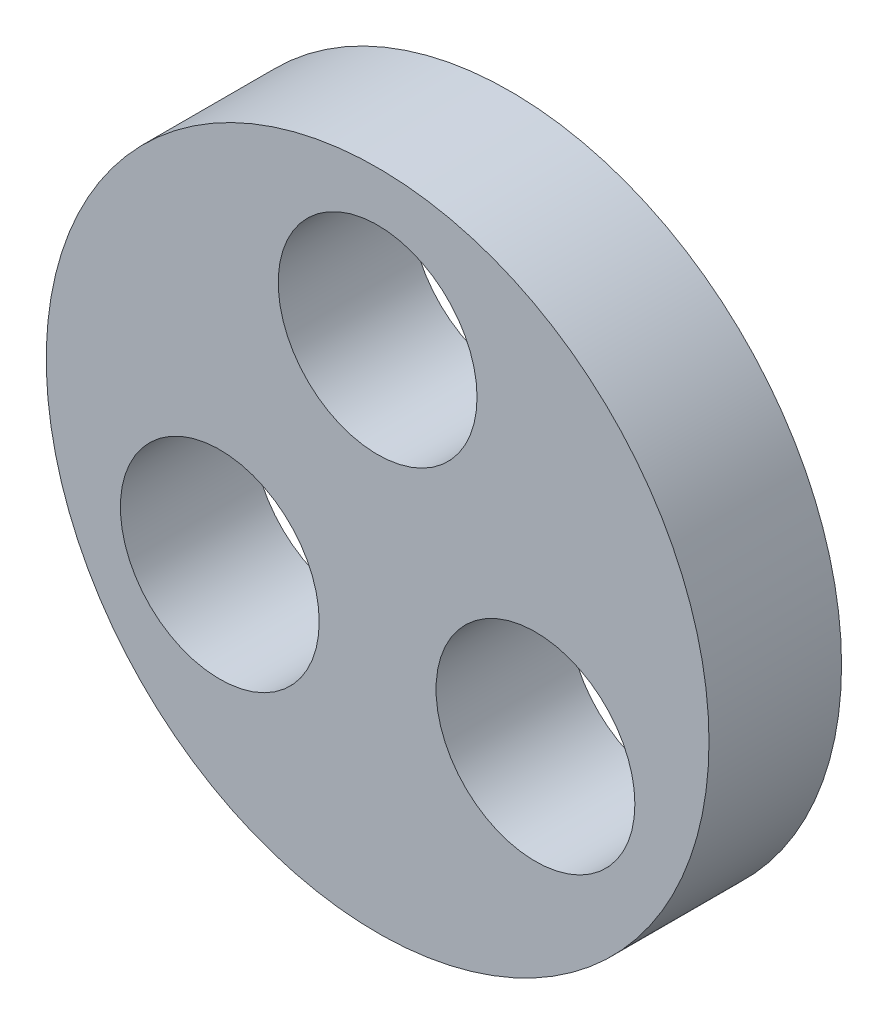
ISO-10303-21;
HEADER;
FILE_DESCRIPTION(('STEP AP214'),'2;1');
FILE_NAME('part.step','',(''),(''),'','','');
FILE_SCHEMA(('AUTOMOTIVE_DESIGN { 1 0 10303 214 1 1 1 1 }'));
ENDSEC;
DATA;
#1=APPLICATION_CONTEXT('core data for automotive mechanical design processes');
#2=APPLICATION_PROTOCOL_DEFINITION('international standard','automotive_design',2000,#1);
#3=PRODUCT_CONTEXT('',#1,'mechanical');
#4=PRODUCT('Part','Part','',(#3));
#5=PRODUCT_RELATED_PRODUCT_CATEGORY('part','',(#4));
#6=PRODUCT_DEFINITION_FORMATION('','',#4);
#7=PRODUCT_DEFINITION_CONTEXT('part definition',#1,'design');
#8=PRODUCT_DEFINITION('design','',#6,#7);
#9=PRODUCT_DEFINITION_SHAPE('','',#8);
#10=(LENGTH_UNIT() NAMED_UNIT(*) SI_UNIT(.MILLI.,.METRE.));
#11=(NAMED_UNIT(*) PLANE_ANGLE_UNIT() SI_UNIT($,.RADIAN.));
#12=(NAMED_UNIT(*) SI_UNIT($,.STERADIAN.) SOLID_ANGLE_UNIT());
#13=UNCERTAINTY_MEASURE_WITH_UNIT(LENGTH_MEASURE(1.E-05),#10,'distance_accuracy_value','');
#14=(GEOMETRIC_REPRESENTATION_CONTEXT(3) GLOBAL_UNCERTAINTY_ASSIGNED_CONTEXT((#13)) GLOBAL_UNIT_ASSIGNED_CONTEXT((#10,
#11,#12)) REPRESENTATION_CONTEXT('',''));
#15=CARTESIAN_POINT('',(0.,0.,0.));
#16=DIRECTION('',(0.,0.,1.));
#17=DIRECTION('',(1.,0.,0.));
#18=AXIS2_PLACEMENT_3D('',#15,#16,#17);
#19=CARTESIAN_POINT('',(0.,0.,3.175));
#20=DIRECTION('',(0.,0.,1.));
#21=DIRECTION('',(1.,0.,0.));
#22=AXIS2_PLACEMENT_3D('',#19,#20,#21);
#23=PLANE('',#22);
#24=CARTESIAN_POINT('',(3.78074215339669,-2.18281249999985,3.175));
#25=DIRECTION('',(0.,0.,1.));
#26=DIRECTION('',(1.,0.,0.));
#27=AXIS2_PLACEMENT_3D('',#24,#25,#26);
#28=CIRCLE('',#27,2.38125);
#29=CARTESIAN_POINT('',(6.16199215339669,-2.18281249999985,3.175));
#30=VERTEX_POINT('',#29);
#31=EDGE_CURVE('E47',#30,#30,#28,.T.);
#32=ORIENTED_EDGE('',*,*,#31,.F.);
#33=EDGE_LOOP('',(#32));
#34=FACE_BOUND('',#33,.T.);
#35=CARTESIAN_POINT('',(0.,0.,3.175));
#36=DIRECTION('',(0.,0.,1.));
#37=DIRECTION('',(1.,0.,0.));
#38=AXIS2_PLACEMENT_3D('',#35,#36,#37);
#39=CIRCLE('',#38,7.9375);
#40=CARTESIAN_POINT('',(7.9375,0.,3.175));
#41=VERTEX_POINT('',#40);
#42=EDGE_CURVE('E10',#41,#41,#39,.T.);
#43=ORIENTED_EDGE('',*,*,#42,.T.);
#44=EDGE_LOOP('',(#43));
#45=FACE_BOUND('',#44,.T.);
#46=CARTESIAN_POINT('',(0.,4.365625,3.175));
#47=DIRECTION('',(0.,0.,1.));
#48=DIRECTION('',(1.,0.,0.));
#49=AXIS2_PLACEMENT_3D('',#46,#47,#48);
#50=CIRCLE('',#49,2.38125);
#51=CARTESIAN_POINT('',(2.38125,4.365625,3.175));
#52=VERTEX_POINT('',#51);
#53=EDGE_CURVE('E42',#52,#52,#50,.T.);
#54=ORIENTED_EDGE('',*,*,#53,.F.);
#55=EDGE_LOOP('',(#54));
#56=FACE_BOUND('',#55,.T.);
#57=CARTESIAN_POINT('',(-3.78074215339619,-2.18281250000015,3.175));
#58=DIRECTION('',(0.,0.,1.));
#59=DIRECTION('',(1.,0.,0.));
#60=AXIS2_PLACEMENT_3D('',#57,#58,#59);
#61=CIRCLE('',#60,2.38125);
#62=CARTESIAN_POINT('',(-1.39949215339619,-2.18281250000015,3.175));
#63=VERTEX_POINT('',#62);
#64=EDGE_CURVE('E53',#63,#63,#61,.T.);
#65=ORIENTED_EDGE('',*,*,#64,.F.);
#66=EDGE_LOOP('',(#65));
#67=FACE_BOUND('',#66,.T.);
#68=ADVANCED_FACE('F31',(#34,#45,#56,#67),#23,.T.);
#69=CARTESIAN_POINT('',(0.,0.,0.));
#70=DIRECTION('',(0.,0.,1.));
#71=DIRECTION('',(1.,0.,0.));
#72=AXIS2_PLACEMENT_3D('',#69,#70,#71);
#73=PLANE('',#72);
#74=CARTESIAN_POINT('',(0.,0.,0.));
#75=DIRECTION('',(0.,0.,1.));
#76=DIRECTION('',(1.,0.,0.));
#77=AXIS2_PLACEMENT_3D('',#74,#75,#76);
#78=CIRCLE('',#77,7.9375);
#79=CARTESIAN_POINT('',(7.9375,0.,0.));
#80=VERTEX_POINT('',#79);
#81=EDGE_CURVE('E35',#80,#80,#78,.T.);
#82=ORIENTED_EDGE('',*,*,#81,.F.);
#83=EDGE_LOOP('',(#82));
#84=FACE_BOUND('',#83,.T.);
#85=CARTESIAN_POINT('',(0.,4.365625,0.));
#86=DIRECTION('',(0.,0.,1.));
#87=DIRECTION('',(1.,0.,0.));
#88=AXIS2_PLACEMENT_3D('',#85,#86,#87);
#89=CIRCLE('',#88,2.38125);
#90=CARTESIAN_POINT('',(2.38125,4.365625,0.));
#91=VERTEX_POINT('',#90);
#92=EDGE_CURVE('E44',#91,#91,#89,.T.);
#93=ORIENTED_EDGE('',*,*,#92,.T.);
#94=EDGE_LOOP('',(#93));
#95=FACE_BOUND('',#94,.T.);
#96=CARTESIAN_POINT('',(3.78074215339669,-2.18281249999985,0.));
#97=DIRECTION('',(0.,0.,1.));
#98=DIRECTION('',(1.,0.,0.));
#99=AXIS2_PLACEMENT_3D('',#96,#97,#98);
#100=CIRCLE('',#99,2.38125);
#101=CARTESIAN_POINT('',(6.16199215339669,-2.18281249999985,0.));
#102=VERTEX_POINT('',#101);
#103=EDGE_CURVE('E50',#102,#102,#100,.T.);
#104=ORIENTED_EDGE('',*,*,#103,.T.);
#105=EDGE_LOOP('',(#104));
#106=FACE_BOUND('',#105,.T.);
#107=CARTESIAN_POINT('',(-3.78074215339619,-2.18281250000015,0.));
#108=DIRECTION('',(0.,0.,1.));
#109=DIRECTION('',(1.,0.,0.));
#110=AXIS2_PLACEMENT_3D('',#107,#108,#109);
#111=CIRCLE('',#110,2.38125);
#112=CARTESIAN_POINT('',(-1.39949215339619,-2.18281250000015,0.));
#113=VERTEX_POINT('',#112);
#114=EDGE_CURVE('E56',#113,#113,#111,.T.);
#115=ORIENTED_EDGE('',*,*,#114,.T.);
#116=EDGE_LOOP('',(#115));
#117=FACE_BOUND('',#116,.T.);
#118=ADVANCED_FACE('F66',(#84,#95,#106,#117),#73,.F.);
#119=CARTESIAN_POINT('',(0.,0.,3.175));
#120=DIRECTION('',(0.,0.,-1.));
#121=DIRECTION('',(-1.,0.,0.));
#122=AXIS2_PLACEMENT_3D('',#119,#120,#121);
#123=CYLINDRICAL_SURFACE('',#122,7.9375);
#124=ORIENTED_EDGE('',*,*,#42,.F.);
#125=EDGE_LOOP('',(#124));
#126=FACE_BOUND('',#125,.T.);
#127=ORIENTED_EDGE('',*,*,#81,.T.);
#128=EDGE_LOOP('',(#127));
#129=FACE_BOUND('',#128,.T.);
#130=ADVANCED_FACE('F33',(#126,#129),#123,.T.);
#131=CARTESIAN_POINT('',(0.,4.365625,3.175));
#132=DIRECTION('',(0.,0.,-1.));
#133=DIRECTION('',(-1.,0.,0.));
#134=AXIS2_PLACEMENT_3D('',#131,#132,#133);
#135=CYLINDRICAL_SURFACE('',#134,2.38125);
#136=ORIENTED_EDGE('',*,*,#53,.T.);
#137=EDGE_LOOP('',(#136));
#138=FACE_BOUND('',#137,.T.);
#139=ORIENTED_EDGE('',*,*,#92,.F.);
#140=EDGE_LOOP('',(#139));
#141=FACE_BOUND('',#140,.T.);
#142=ADVANCED_FACE('F75',(#138,#141),#135,.F.);
#143=CARTESIAN_POINT('',(3.78074215339669,-2.18281249999985,3.175));
#144=DIRECTION('',(0.,0.,-1.));
#145=DIRECTION('',(-1.,0.,0.));
#146=AXIS2_PLACEMENT_3D('',#143,#144,#145);
#147=CYLINDRICAL_SURFACE('',#146,2.38125);
#148=ORIENTED_EDGE('',*,*,#31,.T.);
#149=EDGE_LOOP('',(#148));
#150=FACE_BOUND('',#149,.T.);
#151=ORIENTED_EDGE('',*,*,#103,.F.);
#152=EDGE_LOOP('',(#151));
#153=FACE_BOUND('',#152,.T.);
#154=ADVANCED_FACE('F78',(#150,#153),#147,.F.);
#155=CARTESIAN_POINT('',(-3.78074215339619,-2.18281250000015,3.175));
#156=DIRECTION('',(0.,0.,-1.));
#157=DIRECTION('',(-1.,0.,0.));
#158=AXIS2_PLACEMENT_3D('',#155,#156,#157);
#159=CYLINDRICAL_SURFACE('',#158,2.38125);
#160=ORIENTED_EDGE('',*,*,#64,.T.);
#161=EDGE_LOOP('',(#160));
#162=FACE_BOUND('',#161,.T.);
#163=ORIENTED_EDGE('',*,*,#114,.F.);
#164=EDGE_LOOP('',(#163));
#165=FACE_BOUND('',#164,.T.);
#166=ADVANCED_FACE('F62',(#162,#165),#159,.F.);
#167=CLOSED_SHELL('',(#68,#118,#130,#142,#154,#166));
#168=MANIFOLD_SOLID_BREP('B2',#167);
#169=ADVANCED_BREP_SHAPE_REPRESENTATION('',(#18,#168),#14);
#170=SHAPE_DEFINITION_REPRESENTATION(#9,#169);
ENDSEC;
END-ISO-10303-21;
